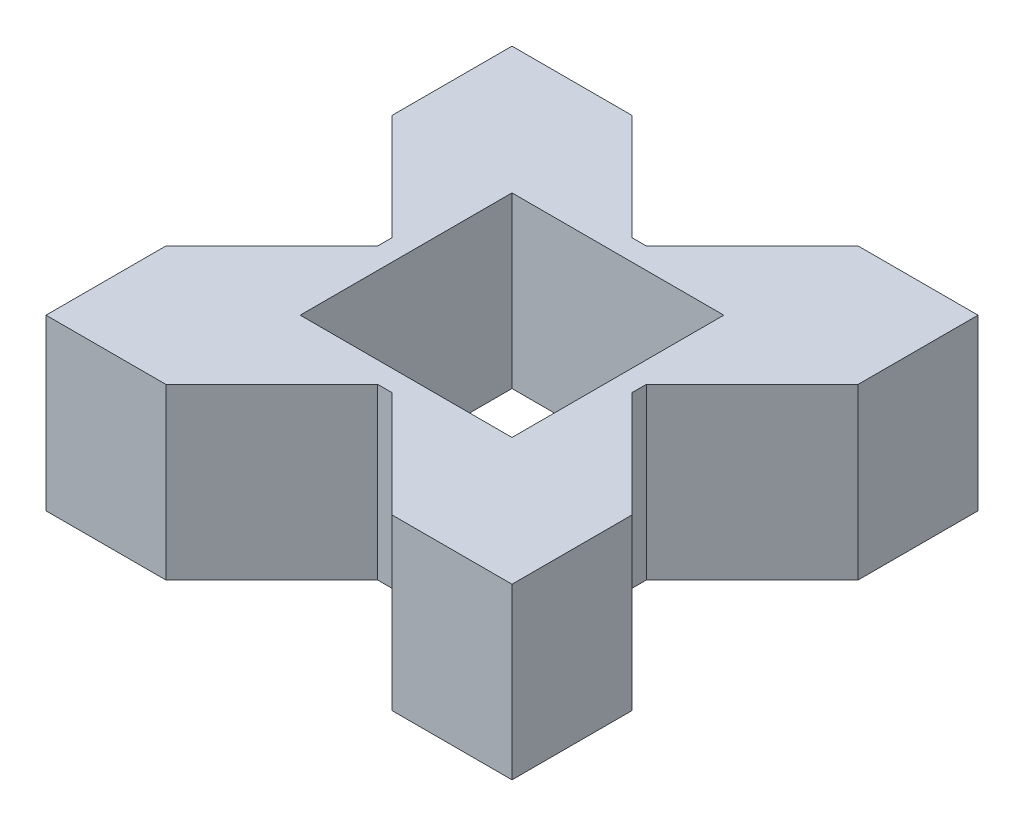
ISO-10303-21;
HEADER;
FILE_DESCRIPTION(('STEP AP214'),'2;1');
FILE_NAME('part.step','',(''),(''),'','','');
FILE_SCHEMA(('AUTOMOTIVE_DESIGN { 1 0 10303 214 1 1 1 1 }'));
ENDSEC;
DATA;
#1=APPLICATION_CONTEXT('core data for automotive mechanical design processes');
#2=APPLICATION_PROTOCOL_DEFINITION('international standard','automotive_design',2000,#1);
#3=PRODUCT_CONTEXT('',#1,'mechanical');
#4=PRODUCT('Part','Part','',(#3));
#5=PRODUCT_RELATED_PRODUCT_CATEGORY('part','',(#4));
#6=PRODUCT_DEFINITION_FORMATION('','',#4);
#7=PRODUCT_DEFINITION_CONTEXT('part definition',#1,'design');
#8=PRODUCT_DEFINITION('design','',#6,#7);
#9=PRODUCT_DEFINITION_SHAPE('','',#8);
#10=(LENGTH_UNIT() NAMED_UNIT(*) SI_UNIT(.MILLI.,.METRE.));
#11=(NAMED_UNIT(*) PLANE_ANGLE_UNIT() SI_UNIT($,.RADIAN.));
#12=(NAMED_UNIT(*) SI_UNIT($,.STERADIAN.) SOLID_ANGLE_UNIT());
#13=UNCERTAINTY_MEASURE_WITH_UNIT(LENGTH_MEASURE(1.E-05),#10,'distance_accuracy_value','');
#14=(GEOMETRIC_REPRESENTATION_CONTEXT(3) GLOBAL_UNCERTAINTY_ASSIGNED_CONTEXT((#13)) GLOBAL_UNIT_ASSIGNED_CONTEXT((#10,
#11,#12)) REPRESENTATION_CONTEXT('',''));
#15=CARTESIAN_POINT('',(0.,0.,0.));
#16=DIRECTION('',(0.,0.,1.));
#17=DIRECTION('',(1.,0.,0.));
#18=AXIS2_PLACEMENT_3D('',#15,#16,#17);
#19=CARTESIAN_POINT('',(15.,20.,0.));
#20=DIRECTION('',(1.,0.,0.));
#21=DIRECTION('',(0.,0.,-1.));
#22=AXIS2_PLACEMENT_3D('',#19,#20,#21);
#23=PLANE('',#22);
#24=DIRECTION('',(0.,0.,1.));
#25=VECTOR('',#24,1.);
#26=CARTESIAN_POINT('',(15.,0.,0.));
#27=LINE('',#26,#25);
#28=CARTESIAN_POINT('',(15.,0.,-0.857864376269064));
#29=VERTEX_POINT('',#28);
#30=CARTESIAN_POINT('',(15.,0.,0.857864376269035));
#31=VERTEX_POINT('',#30);
#32=EDGE_CURVE('E235',#29,#31,#27,.T.);
#33=ORIENTED_EDGE('',*,*,#32,.F.);
#34=DIRECTION('',(0.,-1.,0.));
#35=VECTOR('',#34,1.);
#36=CARTESIAN_POINT('',(15.,20.,-0.857864376269064));
#37=LINE('',#36,#35);
#38=CARTESIAN_POINT('',(15.,20.,-0.857864376269064));
#39=VERTEX_POINT('',#38);
#40=EDGE_CURVE('E11',#39,#29,#37,.T.);
#41=ORIENTED_EDGE('',*,*,#40,.F.);
#42=DIRECTION('',(0.,0.,1.));
#43=VECTOR('',#42,1.);
#44=CARTESIAN_POINT('',(15.,20.,0.));
#45=LINE('',#44,#43);
#46=CARTESIAN_POINT('',(15.,20.,0.857864376269035));
#47=VERTEX_POINT('',#46);
#48=EDGE_CURVE('E239',#39,#47,#45,.T.);
#49=ORIENTED_EDGE('',*,*,#48,.T.);
#50=DIRECTION('',(0.,-1.,0.));
#51=VECTOR('',#50,1.);
#52=CARTESIAN_POINT('',(15.,20.,0.857864376269035));
#53=LINE('',#52,#51);
#54=EDGE_CURVE('E290',#47,#31,#53,.T.);
#55=ORIENTED_EDGE('',*,*,#54,.T.);
#56=EDGE_LOOP('',(#33,#41,#49,#55));
#57=FACE_BOUND('',#56,.T.);
#58=ADVANCED_FACE('F43',(#57),#23,.T.);
#59=CARTESIAN_POINT('',(7.07106781186547,20.,7.07106781186547));
#60=DIRECTION('',(0.707106781186548,0.,0.707106781186548));
#61=DIRECTION('',(0.707106781186548,0.,-0.707106781186548));
#62=AXIS2_PLACEMENT_3D('',#59,#60,#61);
#63=PLANE('',#62);
#64=DIRECTION('',(-0.707106781186548,0.,0.707106781186548));
#65=VECTOR('',#64,1.);
#66=CARTESIAN_POINT('',(7.07106781186547,0.,7.07106781186547));
#67=LINE('',#66,#65);
#68=CARTESIAN_POINT('',(27.5,0.,-13.3578643762691));
#69=VERTEX_POINT('',#68);
#70=EDGE_CURVE('E293',#69,#29,#67,.T.);
#71=ORIENTED_EDGE('',*,*,#70,.F.);
#72=DIRECTION('',(0.,-1.,0.));
#73=VECTOR('',#72,1.);
#74=CARTESIAN_POINT('',(27.5,20.,-13.3578643762691));
#75=LINE('',#74,#73);
#76=CARTESIAN_POINT('',(27.5,20.,-13.3578643762691));
#77=VERTEX_POINT('',#76);
#78=EDGE_CURVE('E50',#77,#69,#75,.T.);
#79=ORIENTED_EDGE('',*,*,#78,.F.);
#80=DIRECTION('',(-0.707106781186548,0.,0.707106781186548));
#81=VECTOR('',#80,1.);
#82=CARTESIAN_POINT('',(7.07106781186547,20.,7.07106781186547));
#83=LINE('',#82,#81);
#84=EDGE_CURVE('E242',#77,#39,#83,.T.);
#85=ORIENTED_EDGE('',*,*,#84,.T.);
#86=ORIENTED_EDGE('',*,*,#40,.T.);
#87=EDGE_LOOP('',(#71,#79,#85,#86));
#88=FACE_BOUND('',#87,.T.);
#89=ADVANCED_FACE('F393',(#88),#63,.T.);
#90=CARTESIAN_POINT('',(27.5,20.,0.));
#91=DIRECTION('',(-1.,0.,0.));
#92=DIRECTION('',(0.,0.,1.));
#93=AXIS2_PLACEMENT_3D('',#90,#91,#92);
#94=PLANE('',#93);
#95=DIRECTION('',(0.,0.,-1.));
#96=VECTOR('',#95,1.);
#97=CARTESIAN_POINT('',(27.5,0.,0.));
#98=LINE('',#97,#96);
#99=CARTESIAN_POINT('',(27.5,0.,-27.5));
#100=VERTEX_POINT('',#99);
#101=EDGE_CURVE('E296',#69,#100,#98,.T.);
#102=ORIENTED_EDGE('',*,*,#101,.T.);
#103=DIRECTION('',(0.,-1.,0.));
#104=VECTOR('',#103,1.);
#105=CARTESIAN_POINT('',(27.5,20.,-27.5));
#106=LINE('',#105,#104);
#107=CARTESIAN_POINT('',(27.5,20.,-27.5));
#108=VERTEX_POINT('',#107);
#109=EDGE_CURVE('E381',#108,#100,#106,.T.);
#110=ORIENTED_EDGE('',*,*,#109,.F.);
#111=DIRECTION('',(0.,0.,-1.));
#112=VECTOR('',#111,1.);
#113=CARTESIAN_POINT('',(27.5,20.,0.));
#114=LINE('',#113,#112);
#115=EDGE_CURVE('E246',#77,#108,#114,.T.);
#116=ORIENTED_EDGE('',*,*,#115,.F.);
#117=ORIENTED_EDGE('',*,*,#78,.T.);
#118=EDGE_LOOP('',(#102,#110,#116,#117));
#119=FACE_BOUND('',#118,.T.);
#120=ADVANCED_FACE('F386',(#119),#94,.F.);
#121=CARTESIAN_POINT('',(0.,20.,-27.5));
#122=DIRECTION('',(0.,0.,1.));
#123=DIRECTION('',(1.,0.,0.));
#124=AXIS2_PLACEMENT_3D('',#121,#122,#123);
#125=PLANE('',#124);
#126=DIRECTION('',(-1.,0.,0.));
#127=VECTOR('',#126,1.);
#128=CARTESIAN_POINT('',(0.,0.,-27.5));
#129=LINE('',#128,#127);
#130=CARTESIAN_POINT('',(13.3578643762691,0.,-27.5));
#131=VERTEX_POINT('',#130);
#132=EDGE_CURVE('E298',#100,#131,#129,.T.);
#133=ORIENTED_EDGE('',*,*,#132,.T.);
#134=DIRECTION('',(0.,-1.,0.));
#135=VECTOR('',#134,1.);
#136=CARTESIAN_POINT('',(13.3578643762691,20.,-27.5));
#137=LINE('',#136,#135);
#138=CARTESIAN_POINT('',(13.3578643762691,20.,-27.5));
#139=VERTEX_POINT('',#138);
#140=EDGE_CURVE('E378',#139,#131,#137,.T.);
#141=ORIENTED_EDGE('',*,*,#140,.F.);
#142=DIRECTION('',(-1.,0.,0.));
#143=VECTOR('',#142,1.);
#144=CARTESIAN_POINT('',(0.,20.,-27.5));
#145=LINE('',#144,#143);
#146=EDGE_CURVE('E248',#108,#139,#145,.T.);
#147=ORIENTED_EDGE('',*,*,#146,.F.);
#148=ORIENTED_EDGE('',*,*,#109,.T.);
#149=EDGE_LOOP('',(#133,#141,#147,#148));
#150=FACE_BOUND('',#149,.T.);
#151=ADVANCED_FACE('F470',(#150),#125,.F.);
#152=CARTESIAN_POINT('',(-7.07106781186548,20.,-7.07106781186548));
#153=DIRECTION('',(0.707106781186548,0.,0.707106781186547));
#154=DIRECTION('',(0.707106781186547,0.,-0.707106781186548));
#155=AXIS2_PLACEMENT_3D('',#152,#153,#154);
#156=PLANE('',#155);
#157=DIRECTION('',(-0.707106781186547,0.,0.707106781186548));
#158=VECTOR('',#157,1.);
#159=CARTESIAN_POINT('',(-7.07106781186548,0.,-7.07106781186548));
#160=LINE('',#159,#158);
#161=CARTESIAN_POINT('',(0.857864376269045,0.,-15.));
#162=VERTEX_POINT('',#161);
#163=EDGE_CURVE('E300',#131,#162,#160,.T.);
#164=ORIENTED_EDGE('',*,*,#163,.T.);
#165=DIRECTION('',(0.,-1.,0.));
#166=VECTOR('',#165,1.);
#167=CARTESIAN_POINT('',(0.857864376269045,20.,-15.));
#168=LINE('',#167,#166);
#169=CARTESIAN_POINT('',(0.857864376269045,20.,-15.));
#170=VERTEX_POINT('',#169);
#171=EDGE_CURVE('E376',#170,#162,#168,.T.);
#172=ORIENTED_EDGE('',*,*,#171,.F.);
#173=DIRECTION('',(-0.707106781186547,0.,0.707106781186548));
#174=VECTOR('',#173,1.);
#175=CARTESIAN_POINT('',(-7.07106781186548,20.,-7.07106781186548));
#176=LINE('',#175,#174);
#177=EDGE_CURVE('E250',#139,#170,#176,.T.);
#178=ORIENTED_EDGE('',*,*,#177,.F.);
#179=ORIENTED_EDGE('',*,*,#140,.T.);
#180=EDGE_LOOP('',(#164,#172,#178,#179));
#181=FACE_BOUND('',#180,.T.);
#182=ADVANCED_FACE('F465',(#181),#156,.F.);
#183=CARTESIAN_POINT('',(0.,20.,-15.));
#184=DIRECTION('',(0.,0.,-1.));
#185=DIRECTION('',(-1.,0.,0.));
#186=AXIS2_PLACEMENT_3D('',#183,#184,#185);
#187=PLANE('',#186);
#188=DIRECTION('',(1.,0.,0.));
#189=VECTOR('',#188,1.);
#190=CARTESIAN_POINT('',(0.,0.,-15.));
#191=LINE('',#190,#189);
#192=CARTESIAN_POINT('',(-0.857864376269044,0.,-15.));
#193=VERTEX_POINT('',#192);
#194=EDGE_CURVE('E303',#193,#162,#191,.T.);
#195=ORIENTED_EDGE('',*,*,#194,.F.);
#196=DIRECTION('',(0.,-1.,0.));
#197=VECTOR('',#196,1.);
#198=CARTESIAN_POINT('',(-0.857864376269044,20.,-15.));
#199=LINE('',#198,#197);
#200=CARTESIAN_POINT('',(-0.857864376269044,20.,-15.));
#201=VERTEX_POINT('',#200);
#202=EDGE_CURVE('E374',#201,#193,#199,.T.);
#203=ORIENTED_EDGE('',*,*,#202,.F.);
#204=DIRECTION('',(1.,0.,0.));
#205=VECTOR('',#204,1.);
#206=CARTESIAN_POINT('',(0.,20.,-15.));
#207=LINE('',#206,#205);
#208=EDGE_CURVE('E252',#201,#170,#207,.T.);
#209=ORIENTED_EDGE('',*,*,#208,.T.);
#210=ORIENTED_EDGE('',*,*,#171,.T.);
#211=EDGE_LOOP('',(#195,#203,#209,#210));
#212=FACE_BOUND('',#211,.T.);
#213=ADVANCED_FACE('F462',(#212),#187,.T.);
#214=CARTESIAN_POINT('',(7.07106781186548,20.,-7.07106781186548));
#215=DIRECTION('',(-0.707106781186547,0.,0.707106781186548));
#216=DIRECTION('',(0.707106781186548,0.,0.707106781186547));
#217=AXIS2_PLACEMENT_3D('',#214,#215,#216);
#218=PLANE('',#217);
#219=DIRECTION('',(-0.707106781186548,0.,-0.707106781186547));
#220=VECTOR('',#219,1.);
#221=CARTESIAN_POINT('',(7.07106781186548,0.,-7.07106781186548));
#222=LINE('',#221,#220);
#223=CARTESIAN_POINT('',(-13.357864376269,0.,-27.5));
#224=VERTEX_POINT('',#223);
#225=EDGE_CURVE('E306',#193,#224,#222,.T.);
#226=ORIENTED_EDGE('',*,*,#225,.T.);
#227=DIRECTION('',(0.,-1.,0.));
#228=VECTOR('',#227,1.);
#229=CARTESIAN_POINT('',(-13.357864376269,20.,-27.5));
#230=LINE('',#229,#228);
#231=CARTESIAN_POINT('',(-13.357864376269,20.,-27.5));
#232=VERTEX_POINT('',#231);
#233=EDGE_CURVE('E371',#232,#224,#230,.T.);
#234=ORIENTED_EDGE('',*,*,#233,.F.);
#235=DIRECTION('',(-0.707106781186548,0.,-0.707106781186547));
#236=VECTOR('',#235,1.);
#237=CARTESIAN_POINT('',(7.07106781186548,20.,-7.07106781186548));
#238=LINE('',#237,#236);
#239=EDGE_CURVE('E255',#201,#232,#238,.T.);
#240=ORIENTED_EDGE('',*,*,#239,.F.);
#241=ORIENTED_EDGE('',*,*,#202,.T.);
#242=EDGE_LOOP('',(#226,#234,#240,#241));
#243=FACE_BOUND('',#242,.T.);
#244=ADVANCED_FACE('F459',(#243),#218,.F.);
#245=CARTESIAN_POINT('',(0.,20.,-27.5));
#246=DIRECTION('',(0.,0.,1.));
#247=DIRECTION('',(1.,0.,0.));
#248=AXIS2_PLACEMENT_3D('',#245,#246,#247);
#249=PLANE('',#248);
#250=DIRECTION('',(-1.,0.,0.));
#251=VECTOR('',#250,1.);
#252=CARTESIAN_POINT('',(0.,0.,-27.5));
#253=LINE('',#252,#251);
#254=CARTESIAN_POINT('',(-27.5,0.,-27.5));
#255=VERTEX_POINT('',#254);
#256=EDGE_CURVE('E308',#224,#255,#253,.T.);
#257=ORIENTED_EDGE('',*,*,#256,.T.);
#258=DIRECTION('',(0.,-1.,0.));
#259=VECTOR('',#258,1.);
#260=CARTESIAN_POINT('',(-27.5,20.,-27.5));
#261=LINE('',#260,#259);
#262=CARTESIAN_POINT('',(-27.5,20.,-27.5));
#263=VERTEX_POINT('',#262);
#264=EDGE_CURVE('E369',#263,#255,#261,.T.);
#265=ORIENTED_EDGE('',*,*,#264,.F.);
#266=DIRECTION('',(-1.,0.,0.));
#267=VECTOR('',#266,1.);
#268=CARTESIAN_POINT('',(0.,20.,-27.5));
#269=LINE('',#268,#267);
#270=EDGE_CURVE('E257',#232,#263,#269,.T.);
#271=ORIENTED_EDGE('',*,*,#270,.F.);
#272=ORIENTED_EDGE('',*,*,#233,.T.);
#273=EDGE_LOOP('',(#257,#265,#271,#272));
#274=FACE_BOUND('',#273,.T.);
#275=ADVANCED_FACE('F454',(#274),#249,.F.);
#276=CARTESIAN_POINT('',(-27.5,20.,0.));
#277=DIRECTION('',(-1.,0.,0.));
#278=DIRECTION('',(0.,0.,1.));
#279=AXIS2_PLACEMENT_3D('',#276,#277,#278);
#280=PLANE('',#279);
#281=DIRECTION('',(0.,0.,-1.));
#282=VECTOR('',#281,1.);
#283=CARTESIAN_POINT('',(-27.5,0.,0.));
#284=LINE('',#283,#282);
#285=CARTESIAN_POINT('',(-27.5,0.,-13.3578643762691));
#286=VERTEX_POINT('',#285);
#287=EDGE_CURVE('E311',#286,#255,#284,.T.);
#288=ORIENTED_EDGE('',*,*,#287,.F.);
#289=DIRECTION('',(0.,-1.,0.));
#290=VECTOR('',#289,1.);
#291=CARTESIAN_POINT('',(-27.5,20.,-13.3578643762691));
#292=LINE('',#291,#290);
#293=CARTESIAN_POINT('',(-27.5,20.,-13.3578643762691));
#294=VERTEX_POINT('',#293);
#295=EDGE_CURVE('E367',#294,#286,#292,.T.);
#296=ORIENTED_EDGE('',*,*,#295,.F.);
#297=DIRECTION('',(0.,0.,-1.));
#298=VECTOR('',#297,1.);
#299=CARTESIAN_POINT('',(-27.5,20.,0.));
#300=LINE('',#299,#298);
#301=EDGE_CURVE('E259',#294,#263,#300,.T.);
#302=ORIENTED_EDGE('',*,*,#301,.T.);
#303=ORIENTED_EDGE('',*,*,#264,.T.);
#304=EDGE_LOOP('',(#288,#296,#302,#303));
#305=FACE_BOUND('',#304,.T.);
#306=ADVANCED_FACE('F448',(#305),#280,.T.);
#307=CARTESIAN_POINT('',(-7.07106781186546,20.,7.07106781186546));
#308=DIRECTION('',(-0.707106781186548,0.,0.707106781186548));
#309=DIRECTION('',(0.707106781186548,0.,0.707106781186548));
#310=AXIS2_PLACEMENT_3D('',#307,#308,#309);
#311=PLANE('',#310);
#312=DIRECTION('',(-0.707106781186548,0.,-0.707106781186548));
#313=VECTOR('',#312,1.);
#314=CARTESIAN_POINT('',(-7.07106781186546,0.,7.07106781186546));
#315=LINE('',#314,#313);
#316=CARTESIAN_POINT('',(-15.,0.,-0.857864376269072));
#317=VERTEX_POINT('',#316);
#318=EDGE_CURVE('E314',#317,#286,#315,.T.);
#319=ORIENTED_EDGE('',*,*,#318,.F.);
#320=DIRECTION('',(0.,-1.,0.));
#321=VECTOR('',#320,1.);
#322=CARTESIAN_POINT('',(-15.,20.,-0.857864376269072));
#323=LINE('',#322,#321);
#324=CARTESIAN_POINT('',(-15.,20.,-0.857864376269072));
#325=VERTEX_POINT('',#324);
#326=EDGE_CURVE('E365',#325,#317,#323,.T.);
#327=ORIENTED_EDGE('',*,*,#326,.F.);
#328=DIRECTION('',(-0.707106781186548,0.,-0.707106781186548));
#329=VECTOR('',#328,1.);
#330=CARTESIAN_POINT('',(-7.07106781186546,20.,7.07106781186546));
#331=LINE('',#330,#329);
#332=EDGE_CURVE('E262',#325,#294,#331,.T.);
#333=ORIENTED_EDGE('',*,*,#332,.T.);
#334=ORIENTED_EDGE('',*,*,#295,.T.);
#335=EDGE_LOOP('',(#319,#327,#333,#334));
#336=FACE_BOUND('',#335,.T.);
#337=ADVANCED_FACE('F442',(#336),#311,.T.);
#338=CARTESIAN_POINT('',(-15.,20.,0.));
#339=DIRECTION('',(1.,0.,0.));
#340=DIRECTION('',(0.,0.,-1.));
#341=AXIS2_PLACEMENT_3D('',#338,#339,#340);
#342=PLANE('',#341);
#343=DIRECTION('',(0.,0.,1.));
#344=VECTOR('',#343,1.);
#345=CARTESIAN_POINT('',(-15.,0.,0.));
#346=LINE('',#345,#344);
#347=CARTESIAN_POINT('',(-15.,0.,0.857864376269047));
#348=VERTEX_POINT('',#347);
#349=EDGE_CURVE('E317',#317,#348,#346,.T.);
#350=ORIENTED_EDGE('',*,*,#349,.T.);
#351=DIRECTION('',(0.,-1.,0.));
#352=VECTOR('',#351,1.);
#353=CARTESIAN_POINT('',(-15.,20.,0.857864376269047));
#354=LINE('',#353,#352);
#355=CARTESIAN_POINT('',(-15.,20.,0.857864376269047));
#356=VERTEX_POINT('',#355);
#357=EDGE_CURVE('E362',#356,#348,#354,.T.);
#358=ORIENTED_EDGE('',*,*,#357,.F.);
#359=DIRECTION('',(0.,0.,1.));
#360=VECTOR('',#359,1.);
#361=CARTESIAN_POINT('',(-15.,20.,0.));
#362=LINE('',#361,#360);
#363=EDGE_CURVE('E265',#325,#356,#362,.T.);
#364=ORIENTED_EDGE('',*,*,#363,.F.);
#365=ORIENTED_EDGE('',*,*,#326,.T.);
#366=EDGE_LOOP('',(#350,#358,#364,#365));
#367=FACE_BOUND('',#366,.T.);
#368=ADVANCED_FACE('F473',(#367),#342,.F.);
#369=CARTESIAN_POINT('',(-7.07106781186548,20.,-7.07106781186548));
#370=DIRECTION('',(0.707106781186548,0.,0.707106781186547));
#371=DIRECTION('',(0.707106781186547,0.,-0.707106781186548));
#372=AXIS2_PLACEMENT_3D('',#369,#370,#371);
#373=PLANE('',#372);
#374=DIRECTION('',(-0.707106781186547,0.,0.707106781186548));
#375=VECTOR('',#374,1.);
#376=CARTESIAN_POINT('',(-7.07106781186548,0.,-7.07106781186548));
#377=LINE('',#376,#375);
#378=CARTESIAN_POINT('',(-27.5,0.,13.3578643762691));
#379=VERTEX_POINT('',#378);
#380=EDGE_CURVE('E319',#348,#379,#377,.T.);
#381=ORIENTED_EDGE('',*,*,#380,.T.);
#382=DIRECTION('',(0.,-1.,0.));
#383=VECTOR('',#382,1.);
#384=CARTESIAN_POINT('',(-27.5,20.,13.3578643762691));
#385=LINE('',#384,#383);
#386=CARTESIAN_POINT('',(-27.5,20.,13.3578643762691));
#387=VERTEX_POINT('',#386);
#388=EDGE_CURVE('E360',#387,#379,#385,.T.);
#389=ORIENTED_EDGE('',*,*,#388,.F.);
#390=DIRECTION('',(-0.707106781186547,0.,0.707106781186548));
#391=VECTOR('',#390,1.);
#392=CARTESIAN_POINT('',(-7.07106781186548,20.,-7.07106781186548));
#393=LINE('',#392,#391);
#394=EDGE_CURVE('E267',#356,#387,#393,.T.);
#395=ORIENTED_EDGE('',*,*,#394,.F.);
#396=ORIENTED_EDGE('',*,*,#357,.T.);
#397=EDGE_LOOP('',(#381,#389,#395,#396));
#398=FACE_BOUND('',#397,.T.);
#399=ADVANCED_FACE('F436',(#398),#373,.F.);
#400=CARTESIAN_POINT('',(-27.5,20.,0.));
#401=DIRECTION('',(-1.,0.,0.));
#402=DIRECTION('',(0.,0.,1.));
#403=AXIS2_PLACEMENT_3D('',#400,#401,#402);
#404=PLANE('',#403);
#405=DIRECTION('',(0.,0.,-1.));
#406=VECTOR('',#405,1.);
#407=CARTESIAN_POINT('',(-27.5,0.,0.));
#408=LINE('',#407,#406);
#409=CARTESIAN_POINT('',(-27.5,0.,27.5));
#410=VERTEX_POINT('',#409);
#411=EDGE_CURVE('E322',#410,#379,#408,.T.);
#412=ORIENTED_EDGE('',*,*,#411,.F.);
#413=DIRECTION('',(0.,-1.,0.));
#414=VECTOR('',#413,1.);
#415=CARTESIAN_POINT('',(-27.5,20.,27.5));
#416=LINE('',#415,#414);
#417=CARTESIAN_POINT('',(-27.5,20.,27.5));
#418=VERTEX_POINT('',#417);
#419=EDGE_CURVE('E358',#418,#410,#416,.T.);
#420=ORIENTED_EDGE('',*,*,#419,.F.);
#421=DIRECTION('',(0.,0.,-1.));
#422=VECTOR('',#421,1.);
#423=CARTESIAN_POINT('',(-27.5,20.,0.));
#424=LINE('',#423,#422);
#425=EDGE_CURVE('E269',#418,#387,#424,.T.);
#426=ORIENTED_EDGE('',*,*,#425,.T.);
#427=ORIENTED_EDGE('',*,*,#388,.T.);
#428=EDGE_LOOP('',(#412,#420,#426,#427));
#429=FACE_BOUND('',#428,.T.);
#430=ADVANCED_FACE('F432',(#429),#404,.T.);
#431=CARTESIAN_POINT('',(0.,20.,27.5));
#432=DIRECTION('',(0.,0.,1.));
#433=DIRECTION('',(1.,0.,0.));
#434=AXIS2_PLACEMENT_3D('',#431,#432,#433);
#435=PLANE('',#434);
#436=DIRECTION('',(-1.,0.,0.));
#437=VECTOR('',#436,1.);
#438=CARTESIAN_POINT('',(0.,0.,27.5));
#439=LINE('',#438,#437);
#440=CARTESIAN_POINT('',(-13.3578643762691,0.,27.5));
#441=VERTEX_POINT('',#440);
#442=EDGE_CURVE('E325',#441,#410,#439,.T.);
#443=ORIENTED_EDGE('',*,*,#442,.F.);
#444=DIRECTION('',(0.,-1.,0.));
#445=VECTOR('',#444,1.);
#446=CARTESIAN_POINT('',(-13.3578643762691,20.,27.5));
#447=LINE('',#446,#445);
#448=CARTESIAN_POINT('',(-13.3578643762691,20.,27.5));
#449=VERTEX_POINT('',#448);
#450=EDGE_CURVE('E356',#449,#441,#447,.T.);
#451=ORIENTED_EDGE('',*,*,#450,.F.);
#452=DIRECTION('',(-1.,0.,0.));
#453=VECTOR('',#452,1.);
#454=CARTESIAN_POINT('',(0.,20.,27.5));
#455=LINE('',#454,#453);
#456=EDGE_CURVE('E272',#449,#418,#455,.T.);
#457=ORIENTED_EDGE('',*,*,#456,.T.);
#458=ORIENTED_EDGE('',*,*,#419,.T.);
#459=EDGE_LOOP('',(#443,#451,#457,#458));
#460=FACE_BOUND('',#459,.T.);
#461=ADVANCED_FACE('F428',(#460),#435,.T.);
#462=CARTESIAN_POINT('',(7.07106781186547,20.,7.07106781186547));
#463=DIRECTION('',(0.707106781186548,0.,0.707106781186548));
#464=DIRECTION('',(0.707106781186548,0.,-0.707106781186548));
#465=AXIS2_PLACEMENT_3D('',#462,#463,#464);
#466=PLANE('',#465);
#467=DIRECTION('',(-0.707106781186548,0.,0.707106781186548));
#468=VECTOR('',#467,1.);
#469=CARTESIAN_POINT('',(7.07106781186547,0.,7.07106781186547));
#470=LINE('',#469,#468);
#471=CARTESIAN_POINT('',(-0.857864376269063,0.,15.));
#472=VERTEX_POINT('',#471);
#473=EDGE_CURVE('E328',#472,#441,#470,.T.);
#474=ORIENTED_EDGE('',*,*,#473,.F.);
#475=DIRECTION('',(0.,-1.,0.));
#476=VECTOR('',#475,1.);
#477=CARTESIAN_POINT('',(-0.857864376269063,20.,15.));
#478=LINE('',#477,#476);
#479=CARTESIAN_POINT('',(-0.857864376269063,20.,15.));
#480=VERTEX_POINT('',#479);
#481=EDGE_CURVE('E354',#480,#472,#478,.T.);
#482=ORIENTED_EDGE('',*,*,#481,.F.);
#483=DIRECTION('',(-0.707106781186548,0.,0.707106781186548));
#484=VECTOR('',#483,1.);
#485=CARTESIAN_POINT('',(7.07106781186547,20.,7.07106781186547));
#486=LINE('',#485,#484);
#487=EDGE_CURVE('E275',#480,#449,#486,.T.);
#488=ORIENTED_EDGE('',*,*,#487,.T.);
#489=ORIENTED_EDGE('',*,*,#450,.T.);
#490=EDGE_LOOP('',(#474,#482,#488,#489));
#491=FACE_BOUND('',#490,.T.);
#492=ADVANCED_FACE('F423',(#491),#466,.T.);
#493=CARTESIAN_POINT('',(0.,20.,15.));
#494=DIRECTION('',(0.,0.,-1.));
#495=DIRECTION('',(-1.,0.,0.));
#496=AXIS2_PLACEMENT_3D('',#493,#494,#495);
#497=PLANE('',#496);
#498=DIRECTION('',(1.,0.,0.));
#499=VECTOR('',#498,1.);
#500=CARTESIAN_POINT('',(0.,0.,15.));
#501=LINE('',#500,#499);
#502=CARTESIAN_POINT('',(0.857864376269067,0.,15.));
#503=VERTEX_POINT('',#502);
#504=EDGE_CURVE('E331',#472,#503,#501,.T.);
#505=ORIENTED_EDGE('',*,*,#504,.T.);
#506=DIRECTION('',(0.,-1.,0.));
#507=VECTOR('',#506,1.);
#508=CARTESIAN_POINT('',(0.857864376269067,20.,15.));
#509=LINE('',#508,#507);
#510=CARTESIAN_POINT('',(0.857864376269067,20.,15.));
#511=VERTEX_POINT('',#510);
#512=EDGE_CURVE('E352',#511,#503,#509,.T.);
#513=ORIENTED_EDGE('',*,*,#512,.F.);
#514=DIRECTION('',(1.,0.,0.));
#515=VECTOR('',#514,1.);
#516=CARTESIAN_POINT('',(0.,20.,15.));
#517=LINE('',#516,#515);
#518=EDGE_CURVE('E278',#480,#511,#517,.T.);
#519=ORIENTED_EDGE('',*,*,#518,.F.);
#520=ORIENTED_EDGE('',*,*,#481,.T.);
#521=EDGE_LOOP('',(#505,#513,#519,#520));
#522=FACE_BOUND('',#521,.T.);
#523=ADVANCED_FACE('F420',(#522),#497,.F.);
#524=CARTESIAN_POINT('',(-7.07106781186546,20.,7.07106781186546));
#525=DIRECTION('',(-0.707106781186548,0.,0.707106781186548));
#526=DIRECTION('',(0.707106781186548,0.,0.707106781186548));
#527=AXIS2_PLACEMENT_3D('',#524,#525,#526);
#528=PLANE('',#527);
#529=DIRECTION('',(-0.707106781186548,0.,-0.707106781186548));
#530=VECTOR('',#529,1.);
#531=CARTESIAN_POINT('',(-7.07106781186546,0.,7.07106781186546));
#532=LINE('',#531,#530);
#533=CARTESIAN_POINT('',(13.3578643762691,0.,27.5));
#534=VERTEX_POINT('',#533);
#535=EDGE_CURVE('E334',#534,#503,#532,.T.);
#536=ORIENTED_EDGE('',*,*,#535,.F.);
#537=DIRECTION('',(0.,-1.,0.));
#538=VECTOR('',#537,1.);
#539=CARTESIAN_POINT('',(13.3578643762691,20.,27.5));
#540=LINE('',#539,#538);
#541=CARTESIAN_POINT('',(13.3578643762691,20.,27.5));
#542=VERTEX_POINT('',#541);
#543=EDGE_CURVE('E350',#542,#534,#540,.T.);
#544=ORIENTED_EDGE('',*,*,#543,.F.);
#545=DIRECTION('',(-0.707106781186548,0.,-0.707106781186548));
#546=VECTOR('',#545,1.);
#547=CARTESIAN_POINT('',(-7.07106781186546,20.,7.07106781186546));
#548=LINE('',#547,#546);
#549=EDGE_CURVE('E280',#542,#511,#548,.T.);
#550=ORIENTED_EDGE('',*,*,#549,.T.);
#551=ORIENTED_EDGE('',*,*,#512,.T.);
#552=EDGE_LOOP('',(#536,#544,#550,#551));
#553=FACE_BOUND('',#552,.T.);
#554=ADVANCED_FACE('F415',(#553),#528,.T.);
#555=CARTESIAN_POINT('',(0.,20.,27.5));
#556=DIRECTION('',(0.,0.,1.));
#557=DIRECTION('',(1.,0.,0.));
#558=AXIS2_PLACEMENT_3D('',#555,#556,#557);
#559=PLANE('',#558);
#560=DIRECTION('',(-1.,0.,0.));
#561=VECTOR('',#560,1.);
#562=CARTESIAN_POINT('',(0.,0.,27.5));
#563=LINE('',#562,#561);
#564=CARTESIAN_POINT('',(27.5,0.,27.5));
#565=VERTEX_POINT('',#564);
#566=EDGE_CURVE('E337',#565,#534,#563,.T.);
#567=ORIENTED_EDGE('',*,*,#566,.F.);
#568=DIRECTION('',(0.,-1.,0.));
#569=VECTOR('',#568,1.);
#570=CARTESIAN_POINT('',(27.5,20.,27.5));
#571=LINE('',#570,#569);
#572=CARTESIAN_POINT('',(27.5,20.,27.5));
#573=VERTEX_POINT('',#572);
#574=EDGE_CURVE('E348',#573,#565,#571,.T.);
#575=ORIENTED_EDGE('',*,*,#574,.F.);
#576=DIRECTION('',(-1.,0.,0.));
#577=VECTOR('',#576,1.);
#578=CARTESIAN_POINT('',(0.,20.,27.5));
#579=LINE('',#578,#577);
#580=EDGE_CURVE('E283',#573,#542,#579,.T.);
#581=ORIENTED_EDGE('',*,*,#580,.T.);
#582=ORIENTED_EDGE('',*,*,#543,.T.);
#583=EDGE_LOOP('',(#567,#575,#581,#582));
#584=FACE_BOUND('',#583,.T.);
#585=ADVANCED_FACE('F410',(#584),#559,.T.);
#586=CARTESIAN_POINT('',(27.5,20.,0.));
#587=DIRECTION('',(-1.,0.,0.));
#588=DIRECTION('',(0.,0.,1.));
#589=AXIS2_PLACEMENT_3D('',#586,#587,#588);
#590=PLANE('',#589);
#591=DIRECTION('',(0.,0.,-1.));
#592=VECTOR('',#591,1.);
#593=CARTESIAN_POINT('',(27.5,0.,0.));
#594=LINE('',#593,#592);
#595=CARTESIAN_POINT('',(27.5,0.,13.357864376269));
#596=VERTEX_POINT('',#595);
#597=EDGE_CURVE('E340',#565,#596,#594,.T.);
#598=ORIENTED_EDGE('',*,*,#597,.T.);
#599=DIRECTION('',(0.,-1.,0.));
#600=VECTOR('',#599,1.);
#601=CARTESIAN_POINT('',(27.5,20.,13.357864376269));
#602=LINE('',#601,#600);
#603=CARTESIAN_POINT('',(27.5,20.,13.357864376269));
#604=VERTEX_POINT('',#603);
#605=EDGE_CURVE('E345',#604,#596,#602,.T.);
#606=ORIENTED_EDGE('',*,*,#605,.F.);
#607=DIRECTION('',(0.,0.,-1.));
#608=VECTOR('',#607,1.);
#609=CARTESIAN_POINT('',(27.5,20.,0.));
#610=LINE('',#609,#608);
#611=EDGE_CURVE('E286',#573,#604,#610,.T.);
#612=ORIENTED_EDGE('',*,*,#611,.F.);
#613=ORIENTED_EDGE('',*,*,#574,.T.);
#614=EDGE_LOOP('',(#598,#606,#612,#613));
#615=FACE_BOUND('',#614,.T.);
#616=ADVANCED_FACE('F407',(#615),#590,.F.);
#617=CARTESIAN_POINT('',(7.07106781186548,20.,-7.07106781186548));
#618=DIRECTION('',(-0.707106781186547,0.,0.707106781186548));
#619=DIRECTION('',(0.707106781186548,0.,0.707106781186547));
#620=AXIS2_PLACEMENT_3D('',#617,#618,#619);
#621=PLANE('',#620);
#622=DIRECTION('',(-0.707106781186548,0.,-0.707106781186547));
#623=VECTOR('',#622,1.);
#624=CARTESIAN_POINT('',(7.07106781186548,0.,-7.07106781186548));
#625=LINE('',#624,#623);
#626=EDGE_CURVE('E243',#596,#31,#625,.T.);
#627=ORIENTED_EDGE('',*,*,#626,.T.);
#628=ORIENTED_EDGE('',*,*,#54,.F.);
#629=DIRECTION('',(-0.707106781186548,0.,-0.707106781186547));
#630=VECTOR('',#629,1.);
#631=CARTESIAN_POINT('',(7.07106781186548,20.,-7.07106781186548));
#632=LINE('',#631,#630);
#633=EDGE_CURVE('E288',#604,#47,#632,.T.);
#634=ORIENTED_EDGE('',*,*,#633,.F.);
#635=ORIENTED_EDGE('',*,*,#605,.T.);
#636=EDGE_LOOP('',(#627,#628,#634,#635));
#637=FACE_BOUND('',#636,.T.);
#638=ADVANCED_FACE('F402',(#637),#621,.F.);
#639=CARTESIAN_POINT('',(0.,20.,0.));
#640=DIRECTION('',(0.,1.,0.));
#641=DIRECTION('',(0.,0.,1.));
#642=AXIS2_PLACEMENT_3D('',#639,#640,#641);
#643=PLANE('',#642);
#644=DIRECTION('',(0.,0.,-1.));
#645=VECTOR('',#644,1.);
#646=CARTESIAN_POINT('',(12.5,20.,-12.5));
#647=LINE('',#646,#645);
#648=CARTESIAN_POINT('',(12.5,20.,12.5));
#649=VERTEX_POINT('',#648);
#650=CARTESIAN_POINT('',(12.5,20.,-12.5));
#651=VERTEX_POINT('',#650);
#652=EDGE_CURVE('E57',#649,#651,#647,.T.);
#653=ORIENTED_EDGE('',*,*,#652,.F.);
#654=DIRECTION('',(1.,0.,0.));
#655=VECTOR('',#654,1.);
#656=CARTESIAN_POINT('',(-12.5,20.,12.5));
#657=LINE('',#656,#655);
#658=CARTESIAN_POINT('',(-12.5,20.,12.5));
#659=VERTEX_POINT('',#658);
#660=EDGE_CURVE('E220',#659,#649,#657,.T.);
#661=ORIENTED_EDGE('',*,*,#660,.F.);
#662=DIRECTION('',(0.,0.,1.));
#663=VECTOR('',#662,1.);
#664=CARTESIAN_POINT('',(-12.5,20.,-12.5));
#665=LINE('',#664,#663);
#666=CARTESIAN_POINT('',(-12.5,20.,-12.5));
#667=VERTEX_POINT('',#666);
#668=EDGE_CURVE('E223',#667,#659,#665,.T.);
#669=ORIENTED_EDGE('',*,*,#668,.F.);
#670=DIRECTION('',(-1.,0.,0.));
#671=VECTOR('',#670,1.);
#672=CARTESIAN_POINT('',(-12.5,20.,-12.5));
#673=LINE('',#672,#671);
#674=EDGE_CURVE('E229',#651,#667,#673,.T.);
#675=ORIENTED_EDGE('',*,*,#674,.F.);
#676=EDGE_LOOP('',(#653,#661,#669,#675));
#677=FACE_BOUND('',#676,.T.);
#678=ORIENTED_EDGE('',*,*,#48,.F.);
#679=ORIENTED_EDGE('',*,*,#84,.F.);
#680=ORIENTED_EDGE('',*,*,#115,.T.);
#681=ORIENTED_EDGE('',*,*,#146,.T.);
#682=ORIENTED_EDGE('',*,*,#177,.T.);
#683=ORIENTED_EDGE('',*,*,#208,.F.);
#684=ORIENTED_EDGE('',*,*,#239,.T.);
#685=ORIENTED_EDGE('',*,*,#270,.T.);
#686=ORIENTED_EDGE('',*,*,#301,.F.);
#687=ORIENTED_EDGE('',*,*,#332,.F.);
#688=ORIENTED_EDGE('',*,*,#363,.T.);
#689=ORIENTED_EDGE('',*,*,#394,.T.);
#690=ORIENTED_EDGE('',*,*,#425,.F.);
#691=ORIENTED_EDGE('',*,*,#456,.F.);
#692=ORIENTED_EDGE('',*,*,#487,.F.);
#693=ORIENTED_EDGE('',*,*,#518,.T.);
#694=ORIENTED_EDGE('',*,*,#549,.F.);
#695=ORIENTED_EDGE('',*,*,#580,.F.);
#696=ORIENTED_EDGE('',*,*,#611,.T.);
#697=ORIENTED_EDGE('',*,*,#633,.T.);
#698=EDGE_LOOP('',(#678,#679,#680,#681,#682,#683,#684,#685,#686,#687,#688,#689,#690,#691,#692,
#693,#694,#695,#696,#697));
#699=FACE_BOUND('',#698,.T.);
#700=ADVANCED_FACE('F472',(#677,#699),#643,.T.);
#701=CARTESIAN_POINT('',(0.,0.,0.));
#702=DIRECTION('',(0.,1.,0.));
#703=DIRECTION('',(0.,0.,1.));
#704=AXIS2_PLACEMENT_3D('',#701,#702,#703);
#705=PLANE('',#704);
#706=DIRECTION('',(1.,0.,0.));
#707=VECTOR('',#706,1.);
#708=CARTESIAN_POINT('',(-12.5,0.,12.5));
#709=LINE('',#708,#707);
#710=CARTESIAN_POINT('',(-12.5,0.,12.5));
#711=VERTEX_POINT('',#710);
#712=CARTESIAN_POINT('',(12.5,0.,12.5));
#713=VERTEX_POINT('',#712);
#714=EDGE_CURVE('E210',#711,#713,#709,.T.);
#715=ORIENTED_EDGE('',*,*,#714,.T.);
#716=DIRECTION('',(0.,0.,-1.));
#717=VECTOR('',#716,1.);
#718=CARTESIAN_POINT('',(12.5,0.,-12.5));
#719=LINE('',#718,#717);
#720=CARTESIAN_POINT('',(12.5,0.,-12.5));
#721=VERTEX_POINT('',#720);
#722=EDGE_CURVE('E204',#713,#721,#719,.T.);
#723=ORIENTED_EDGE('',*,*,#722,.T.);
#724=DIRECTION('',(-1.,0.,0.));
#725=VECTOR('',#724,1.);
#726=CARTESIAN_POINT('',(-12.5,0.,-12.5));
#727=LINE('',#726,#725);
#728=CARTESIAN_POINT('',(-12.5,0.,-12.5));
#729=VERTEX_POINT('',#728);
#730=EDGE_CURVE('E213',#721,#729,#727,.T.);
#731=ORIENTED_EDGE('',*,*,#730,.T.);
#732=DIRECTION('',(0.,0.,1.));
#733=VECTOR('',#732,1.);
#734=CARTESIAN_POINT('',(-12.5,0.,-12.5));
#735=LINE('',#734,#733);
#736=EDGE_CURVE('E65',#729,#711,#735,.T.);
#737=ORIENTED_EDGE('',*,*,#736,.T.);
#738=EDGE_LOOP('',(#715,#723,#731,#737));
#739=FACE_BOUND('',#738,.T.);
#740=ORIENTED_EDGE('',*,*,#32,.T.);
#741=ORIENTED_EDGE('',*,*,#626,.F.);
#742=ORIENTED_EDGE('',*,*,#597,.F.);
#743=ORIENTED_EDGE('',*,*,#566,.T.);
#744=ORIENTED_EDGE('',*,*,#535,.T.);
#745=ORIENTED_EDGE('',*,*,#504,.F.);
#746=ORIENTED_EDGE('',*,*,#473,.T.);
#747=ORIENTED_EDGE('',*,*,#442,.T.);
#748=ORIENTED_EDGE('',*,*,#411,.T.);
#749=ORIENTED_EDGE('',*,*,#380,.F.);
#750=ORIENTED_EDGE('',*,*,#349,.F.);
#751=ORIENTED_EDGE('',*,*,#318,.T.);
#752=ORIENTED_EDGE('',*,*,#287,.T.);
#753=ORIENTED_EDGE('',*,*,#256,.F.);
#754=ORIENTED_EDGE('',*,*,#225,.F.);
#755=ORIENTED_EDGE('',*,*,#194,.T.);
#756=ORIENTED_EDGE('',*,*,#163,.F.);
#757=ORIENTED_EDGE('',*,*,#132,.F.);
#758=ORIENTED_EDGE('',*,*,#101,.F.);
#759=ORIENTED_EDGE('',*,*,#70,.T.);
#760=EDGE_LOOP('',(#740,#741,#742,#743,#744,#745,#746,#747,#748,#749,#750,#751,#752,#753,#754,
#755,#756,#757,#758,#759));
#761=FACE_BOUND('',#760,.T.);
#762=ADVANCED_FACE('F217',(#739,#761),#705,.F.);
#763=CARTESIAN_POINT('',(12.5,0.,-12.5));
#764=DIRECTION('',(1.,0.,0.));
#765=DIRECTION('',(0.,0.,-1.));
#766=AXIS2_PLACEMENT_3D('',#763,#764,#765);
#767=PLANE('',#766);
#768=ORIENTED_EDGE('',*,*,#652,.T.);
#769=DIRECTION('',(0.,1.,0.));
#770=VECTOR('',#769,1.);
#771=CARTESIAN_POINT('',(12.5,0.,-12.5));
#772=LINE('',#771,#770);
#773=EDGE_CURVE('E200',#721,#651,#772,.T.);
#774=ORIENTED_EDGE('',*,*,#773,.F.);
#775=ORIENTED_EDGE('',*,*,#722,.F.);
#776=DIRECTION('',(0.,1.,0.));
#777=VECTOR('',#776,1.);
#778=CARTESIAN_POINT('',(12.5,0.,12.5));
#779=LINE('',#778,#777);
#780=EDGE_CURVE('E233',#713,#649,#779,.T.);
#781=ORIENTED_EDGE('',*,*,#780,.T.);
#782=EDGE_LOOP('',(#768,#774,#775,#781));
#783=FACE_BOUND('',#782,.T.);
#784=ADVANCED_FACE('F202',(#783),#767,.F.);
#785=CARTESIAN_POINT('',(-12.5,0.,12.5));
#786=DIRECTION('',(0.,0.,1.));
#787=DIRECTION('',(1.,0.,0.));
#788=AXIS2_PLACEMENT_3D('',#785,#786,#787);
#789=PLANE('',#788);
#790=ORIENTED_EDGE('',*,*,#660,.T.);
#791=ORIENTED_EDGE('',*,*,#780,.F.);
#792=ORIENTED_EDGE('',*,*,#714,.F.);
#793=DIRECTION('',(0.,1.,0.));
#794=VECTOR('',#793,1.);
#795=CARTESIAN_POINT('',(-12.5,0.,12.5));
#796=LINE('',#795,#794);
#797=EDGE_CURVE('E236',#711,#659,#796,.T.);
#798=ORIENTED_EDGE('',*,*,#797,.T.);
#799=EDGE_LOOP('',(#790,#791,#792,#798));
#800=FACE_BOUND('',#799,.T.);
#801=ADVANCED_FACE('F654',(#800),#789,.F.);
#802=CARTESIAN_POINT('',(-12.5,0.,-12.5));
#803=DIRECTION('',(-1.,0.,0.));
#804=DIRECTION('',(0.,0.,1.));
#805=AXIS2_PLACEMENT_3D('',#802,#803,#804);
#806=PLANE('',#805);
#807=ORIENTED_EDGE('',*,*,#668,.T.);
#808=ORIENTED_EDGE('',*,*,#797,.F.);
#809=ORIENTED_EDGE('',*,*,#736,.F.);
#810=DIRECTION('',(0.,1.,0.));
#811=VECTOR('',#810,1.);
#812=CARTESIAN_POINT('',(-12.5,0.,-12.5));
#813=LINE('',#812,#811);
#814=EDGE_CURVE('E209',#729,#667,#813,.T.);
#815=ORIENTED_EDGE('',*,*,#814,.T.);
#816=EDGE_LOOP('',(#807,#808,#809,#815));
#817=FACE_BOUND('',#816,.T.);
#818=ADVANCED_FACE('F663',(#817),#806,.F.);
#819=CARTESIAN_POINT('',(-12.5,0.,-12.5));
#820=DIRECTION('',(0.,0.,-1.));
#821=DIRECTION('',(-1.,0.,0.));
#822=AXIS2_PLACEMENT_3D('',#819,#820,#821);
#823=PLANE('',#822);
#824=ORIENTED_EDGE('',*,*,#674,.T.);
#825=ORIENTED_EDGE('',*,*,#814,.F.);
#826=ORIENTED_EDGE('',*,*,#730,.F.);
#827=ORIENTED_EDGE('',*,*,#773,.T.);
#828=EDGE_LOOP('',(#824,#825,#826,#827));
#829=FACE_BOUND('',#828,.T.);
#830=ADVANCED_FACE('F214',(#829),#823,.F.);
#831=CLOSED_SHELL('',(#58,#89,#120,#151,#182,#213,#244,#275,#306,#337,#368,#399,#430,#461,#492,
#523,#554,#585,#616,#638,#700,#762,#784,#801,#818,#830));
#832=MANIFOLD_SOLID_BREP('B2',#831);
#833=ADVANCED_BREP_SHAPE_REPRESENTATION('',(#18,#832),#14);
#834=SHAPE_DEFINITION_REPRESENTATION(#9,#833);
ENDSEC;
END-ISO-10303-21;
